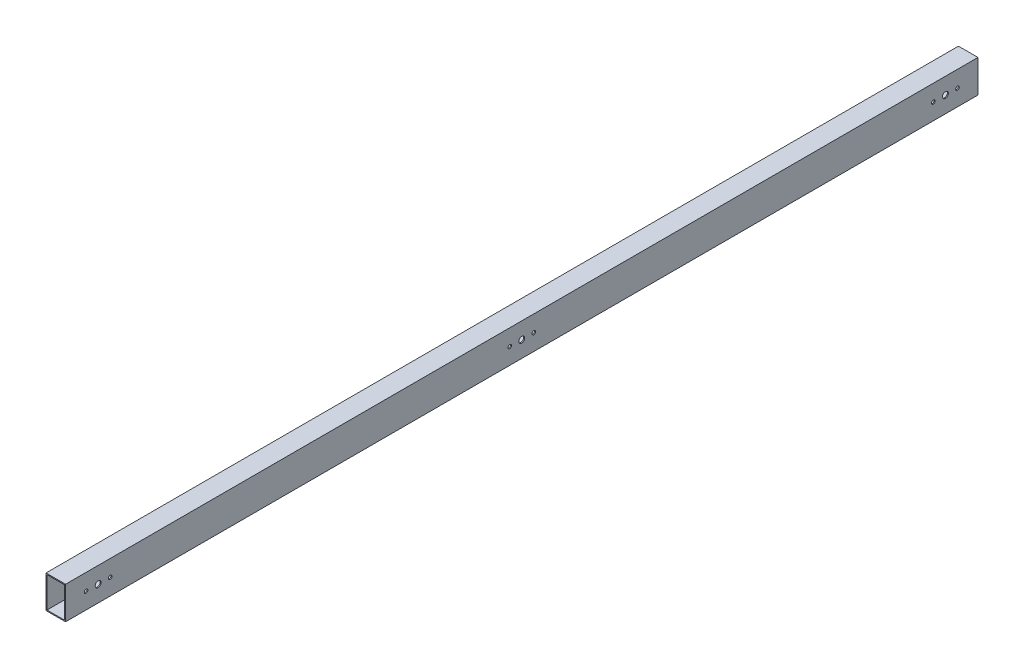
ISO-10303-21;
HEADER;
FILE_DESCRIPTION(('STEP AP214'),'2;1');
FILE_NAME('part.step','',(''),(''),'','','');
FILE_SCHEMA(('AUTOMOTIVE_DESIGN { 1 0 10303 214 1 1 1 1 }'));
ENDSEC;
DATA;
#1=APPLICATION_CONTEXT('core data for automotive mechanical design processes');
#2=APPLICATION_PROTOCOL_DEFINITION('international standard','automotive_design',2000,#1);
#3=PRODUCT_CONTEXT('',#1,'mechanical');
#4=PRODUCT('Part','Part','',(#3));
#5=PRODUCT_RELATED_PRODUCT_CATEGORY('part','',(#4));
#6=PRODUCT_DEFINITION_FORMATION('','',#4);
#7=PRODUCT_DEFINITION_CONTEXT('part definition',#1,'design');
#8=PRODUCT_DEFINITION('design','',#6,#7);
#9=PRODUCT_DEFINITION_SHAPE('','',#8);
#10=(LENGTH_UNIT() NAMED_UNIT(*) SI_UNIT(.MILLI.,.METRE.));
#11=(NAMED_UNIT(*) PLANE_ANGLE_UNIT() SI_UNIT($,.RADIAN.));
#12=(NAMED_UNIT(*) SI_UNIT($,.STERADIAN.) SOLID_ANGLE_UNIT());
#13=UNCERTAINTY_MEASURE_WITH_UNIT(LENGTH_MEASURE(1.E-05),#10,'distance_accuracy_value','');
#14=(GEOMETRIC_REPRESENTATION_CONTEXT(3) GLOBAL_UNCERTAINTY_ASSIGNED_CONTEXT((#13)) GLOBAL_UNIT_ASSIGNED_CONTEXT((#10,
#11,#12)) REPRESENTATION_CONTEXT('',''));
#15=CARTESIAN_POINT('',(0.,0.,0.));
#16=DIRECTION('',(0.,0.,1.));
#17=DIRECTION('',(1.,0.,0.));
#18=AXIS2_PLACEMENT_3D('',#15,#16,#17);
#19=CARTESIAN_POINT('',(30.,0.,1400.));
#20=DIRECTION('',(-1.,0.,0.));
#21=DIRECTION('',(0.,0.,1.));
#22=AXIS2_PLACEMENT_3D('',#19,#20,#21);
#23=PLANE('',#22);
#24=DIRECTION('',(0.,1.,0.));
#25=VECTOR('',#24,1.);
#26=CARTESIAN_POINT('',(30.,0.,0.));
#27=LINE('',#26,#25);
#28=CARTESIAN_POINT('',(30.,0.,0.));
#29=VERTEX_POINT('',#28);
#30=CARTESIAN_POINT('',(30.,50.,0.));
#31=VERTEX_POINT('',#30);
#32=EDGE_CURVE('E154',#29,#31,#27,.T.);
#33=ORIENTED_EDGE('',*,*,#32,.T.);
#34=DIRECTION('',(0.,0.,-1.));
#35=VECTOR('',#34,1.);
#36=CARTESIAN_POINT('',(30.,50.,1400.));
#37=LINE('',#36,#35);
#38=CARTESIAN_POINT('',(30.,50.,1400.));
#39=VERTEX_POINT('',#38);
#40=EDGE_CURVE('E159',#39,#31,#37,.T.);
#41=ORIENTED_EDGE('',*,*,#40,.F.);
#42=DIRECTION('',(0.,1.,0.));
#43=VECTOR('',#42,1.);
#44=CARTESIAN_POINT('',(30.,0.,1400.));
#45=LINE('',#44,#43);
#46=CARTESIAN_POINT('',(30.,0.,1400.));
#47=VERTEX_POINT('',#46);
#48=EDGE_CURVE('E145',#47,#39,#45,.T.);
#49=ORIENTED_EDGE('',*,*,#48,.F.);
#50=DIRECTION('',(0.,0.,-1.));
#51=VECTOR('',#50,1.);
#52=CARTESIAN_POINT('',(30.,0.,1400.));
#53=LINE('',#52,#51);
#54=EDGE_CURVE('E42',#47,#29,#53,.T.);
#55=ORIENTED_EDGE('',*,*,#54,.T.);
#56=EDGE_LOOP('',(#33,#41,#49,#55));
#57=FACE_BOUND('',#56,.T.);
#58=CARTESIAN_POINT('',(30.,25.,681.5));
#59=DIRECTION('',(1.,0.,0.));
#60=DIRECTION('',(0.,0.,-1.));
#61=AXIS2_PLACEMENT_3D('',#58,#59,#60);
#62=CIRCLE('',#61,2.74999999999999);
#63=CARTESIAN_POINT('',(30.,25.,678.75));
#64=VERTEX_POINT('',#63);
#65=EDGE_CURVE('E245',#64,#64,#62,.T.);
#66=ORIENTED_EDGE('',*,*,#65,.F.);
#67=EDGE_LOOP('',(#66));
#68=FACE_BOUND('',#67,.T.);
#69=CARTESIAN_POINT('',(30.,25.,718.5));
#70=DIRECTION('',(1.,0.,0.));
#71=DIRECTION('',(0.,0.,-1.));
#72=AXIS2_PLACEMENT_3D('',#69,#70,#71);
#73=CIRCLE('',#72,2.74999999999999);
#74=CARTESIAN_POINT('',(30.,25.,715.75));
#75=VERTEX_POINT('',#74);
#76=EDGE_CURVE('E238',#75,#75,#73,.T.);
#77=ORIENTED_EDGE('',*,*,#76,.F.);
#78=EDGE_LOOP('',(#77));
#79=FACE_BOUND('',#78,.T.);
#80=CARTESIAN_POINT('',(30.,25.,31.5000000000001));
#81=DIRECTION('',(1.,0.,0.));
#82=DIRECTION('',(0.,0.,-1.));
#83=AXIS2_PLACEMENT_3D('',#80,#81,#82);
#84=CIRCLE('',#83,2.74999999999999);
#85=CARTESIAN_POINT('',(30.,25.,28.7500000000001));
#86=VERTEX_POINT('',#85);
#87=EDGE_CURVE('E231',#86,#86,#84,.T.);
#88=ORIENTED_EDGE('',*,*,#87,.F.);
#89=EDGE_LOOP('',(#88));
#90=FACE_BOUND('',#89,.T.);
#91=CARTESIAN_POINT('',(30.,25.,68.5));
#92=DIRECTION('',(1.,0.,0.));
#93=DIRECTION('',(0.,0.,-1.));
#94=AXIS2_PLACEMENT_3D('',#91,#92,#93);
#95=CIRCLE('',#94,2.74999999999999);
#96=CARTESIAN_POINT('',(30.,25.,65.75));
#97=VERTEX_POINT('',#96);
#98=EDGE_CURVE('E224',#97,#97,#95,.T.);
#99=ORIENTED_EDGE('',*,*,#98,.F.);
#100=EDGE_LOOP('',(#99));
#101=FACE_BOUND('',#100,.T.);
#102=CARTESIAN_POINT('',(30.,25.,1331.5));
#103=DIRECTION('',(1.,0.,0.));
#104=DIRECTION('',(0.,0.,-1.));
#105=AXIS2_PLACEMENT_3D('',#102,#103,#104);
#106=CIRCLE('',#105,2.74999999999999);
#107=CARTESIAN_POINT('',(30.,25.,1328.75));
#108=VERTEX_POINT('',#107);
#109=EDGE_CURVE('E217',#108,#108,#106,.T.);
#110=ORIENTED_EDGE('',*,*,#109,.F.);
#111=EDGE_LOOP('',(#110));
#112=FACE_BOUND('',#111,.T.);
#113=CARTESIAN_POINT('',(30.,25.,1368.5));
#114=DIRECTION('',(1.,0.,0.));
#115=DIRECTION('',(0.,0.,-1.));
#116=AXIS2_PLACEMENT_3D('',#113,#114,#115);
#117=CIRCLE('',#116,2.74999999999999);
#118=CARTESIAN_POINT('',(30.,25.,1365.75));
#119=VERTEX_POINT('',#118);
#120=EDGE_CURVE('E194',#119,#119,#117,.T.);
#121=ORIENTED_EDGE('',*,*,#120,.F.);
#122=EDGE_LOOP('',(#121));
#123=FACE_BOUND('',#122,.T.);
#124=CARTESIAN_POINT('',(30.,25.,50.));
#125=DIRECTION('',(1.,0.,0.));
#126=DIRECTION('',(0.,0.,-1.));
#127=AXIS2_PLACEMENT_3D('',#124,#125,#126);
#128=CIRCLE('',#127,4.49999999999999);
#129=CARTESIAN_POINT('',(30.,25.,45.5000000000001));
#130=VERTEX_POINT('',#129);
#131=EDGE_CURVE('E197',#130,#130,#128,.T.);
#132=ORIENTED_EDGE('',*,*,#131,.F.);
#133=EDGE_LOOP('',(#132));
#134=FACE_BOUND('',#133,.T.);
#135=CARTESIAN_POINT('',(30.,25.,1350.));
#136=DIRECTION('',(1.,0.,0.));
#137=DIRECTION('',(0.,0.,-1.));
#138=AXIS2_PLACEMENT_3D('',#135,#136,#137);
#139=CIRCLE('',#138,4.49999999999999);
#140=CARTESIAN_POINT('',(30.,25.,1345.5));
#141=VERTEX_POINT('',#140);
#142=EDGE_CURVE('E363',#141,#141,#139,.T.);
#143=ORIENTED_EDGE('',*,*,#142,.F.);
#144=EDGE_LOOP('',(#143));
#145=FACE_BOUND('',#144,.T.);
#146=CARTESIAN_POINT('',(30.,25.,700.));
#147=DIRECTION('',(1.,0.,0.));
#148=DIRECTION('',(0.,0.,-1.));
#149=AXIS2_PLACEMENT_3D('',#146,#147,#148);
#150=CIRCLE('',#149,4.49999999999999);
#151=CARTESIAN_POINT('',(30.,25.,695.5));
#152=VERTEX_POINT('',#151);
#153=EDGE_CURVE('E359',#152,#152,#150,.T.);
#154=ORIENTED_EDGE('',*,*,#153,.F.);
#155=EDGE_LOOP('',(#154));
#156=FACE_BOUND('',#155,.T.);
#157=ADVANCED_FACE('F33',(#57,#68,#79,#90,#101,#112,#123,#134,#145,#156),#23,.F.);
#158=CARTESIAN_POINT('',(0.,0.,1400.));
#159=DIRECTION('',(0.,0.,-1.));
#160=DIRECTION('',(-1.,0.,0.));
#161=AXIS2_PLACEMENT_3D('',#158,#159,#160);
#162=PLANE('',#161);
#163=DIRECTION('',(0.,-1.,0.));
#164=VECTOR('',#163,1.);
#165=CARTESIAN_POINT('',(0.,0.,1400.));
#166=LINE('',#165,#164);
#167=CARTESIAN_POINT('',(0.,50.,1400.));
#168=VERTEX_POINT('',#167);
#169=CARTESIAN_POINT('',(0.,0.,1400.));
#170=VERTEX_POINT('',#169);
#171=EDGE_CURVE('E139',#168,#170,#166,.T.);
#172=ORIENTED_EDGE('',*,*,#171,.T.);
#173=DIRECTION('',(1.,0.,0.));
#174=VECTOR('',#173,1.);
#175=CARTESIAN_POINT('',(0.,0.,1400.));
#176=LINE('',#175,#174);
#177=EDGE_CURVE('E142',#170,#47,#176,.T.);
#178=ORIENTED_EDGE('',*,*,#177,.T.);
#179=ORIENTED_EDGE('',*,*,#48,.T.);
#180=DIRECTION('',(-1.,0.,0.));
#181=VECTOR('',#180,1.);
#182=CARTESIAN_POINT('',(0.,50.,1400.));
#183=LINE('',#182,#181);
#184=EDGE_CURVE('E147',#39,#168,#183,.T.);
#185=ORIENTED_EDGE('',*,*,#184,.T.);
#186=EDGE_LOOP('',(#172,#178,#179,#185));
#187=FACE_BOUND('',#186,.T.);
#188=DIRECTION('',(0.,-1.,0.));
#189=VECTOR('',#188,1.);
#190=CARTESIAN_POINT('',(1.5,1.5,1400.));
#191=LINE('',#190,#189);
#192=CARTESIAN_POINT('',(1.5,48.5,1400.));
#193=VERTEX_POINT('',#192);
#194=CARTESIAN_POINT('',(1.5,1.5,1400.));
#195=VERTEX_POINT('',#194);
#196=EDGE_CURVE('E100',#193,#195,#191,.T.);
#197=ORIENTED_EDGE('',*,*,#196,.F.);
#198=DIRECTION('',(-1.,0.,0.));
#199=VECTOR('',#198,1.);
#200=CARTESIAN_POINT('',(1.5,48.5,1400.));
#201=LINE('',#200,#199);
#202=CARTESIAN_POINT('',(28.5,48.5,1400.));
#203=VERTEX_POINT('',#202);
#204=EDGE_CURVE('E123',#203,#193,#201,.T.);
#205=ORIENTED_EDGE('',*,*,#204,.F.);
#206=DIRECTION('',(0.,1.,0.));
#207=VECTOR('',#206,1.);
#208=CARTESIAN_POINT('',(28.5,1.5,1400.));
#209=LINE('',#208,#207);
#210=CARTESIAN_POINT('',(28.5,1.5,1400.));
#211=VERTEX_POINT('',#210);
#212=EDGE_CURVE('E121',#211,#203,#209,.T.);
#213=ORIENTED_EDGE('',*,*,#212,.F.);
#214=DIRECTION('',(1.,0.,0.));
#215=VECTOR('',#214,1.);
#216=CARTESIAN_POINT('',(1.5,1.5,1400.));
#217=LINE('',#216,#215);
#218=EDGE_CURVE('E108',#195,#211,#217,.T.);
#219=ORIENTED_EDGE('',*,*,#218,.F.);
#220=EDGE_LOOP('',(#197,#205,#213,#219));
#221=FACE_BOUND('',#220,.T.);
#222=ADVANCED_FACE('F120',(#187,#221),#162,.F.);
#223=CARTESIAN_POINT('',(0.,0.,0.));
#224=DIRECTION('',(0.,0.,-1.));
#225=DIRECTION('',(-1.,0.,0.));
#226=AXIS2_PLACEMENT_3D('',#223,#224,#225);
#227=PLANE('',#226);
#228=DIRECTION('',(0.,-1.,0.));
#229=VECTOR('',#228,1.);
#230=CARTESIAN_POINT('',(0.,0.,0.));
#231=LINE('',#230,#229);
#232=CARTESIAN_POINT('',(0.,50.,0.));
#233=VERTEX_POINT('',#232);
#234=CARTESIAN_POINT('',(0.,0.,0.));
#235=VERTEX_POINT('',#234);
#236=EDGE_CURVE('E116',#233,#235,#231,.T.);
#237=ORIENTED_EDGE('',*,*,#236,.F.);
#238=DIRECTION('',(-1.,0.,0.));
#239=VECTOR('',#238,1.);
#240=CARTESIAN_POINT('',(0.,50.,0.));
#241=LINE('',#240,#239);
#242=EDGE_CURVE('E143',#31,#233,#241,.T.);
#243=ORIENTED_EDGE('',*,*,#242,.F.);
#244=ORIENTED_EDGE('',*,*,#32,.F.);
#245=DIRECTION('',(1.,0.,0.));
#246=VECTOR('',#245,1.);
#247=CARTESIAN_POINT('',(0.,0.,0.));
#248=LINE('',#247,#246);
#249=EDGE_CURVE('E152',#235,#29,#248,.T.);
#250=ORIENTED_EDGE('',*,*,#249,.F.);
#251=EDGE_LOOP('',(#237,#243,#244,#250));
#252=FACE_BOUND('',#251,.T.);
#253=DIRECTION('',(-1.,0.,0.));
#254=VECTOR('',#253,1.);
#255=CARTESIAN_POINT('',(1.5,48.5,0.));
#256=LINE('',#255,#254);
#257=CARTESIAN_POINT('',(28.5,48.5,0.));
#258=VERTEX_POINT('',#257);
#259=CARTESIAN_POINT('',(1.5,48.5,0.));
#260=VERTEX_POINT('',#259);
#261=EDGE_CURVE('E109',#258,#260,#256,.T.);
#262=ORIENTED_EDGE('',*,*,#261,.T.);
#263=DIRECTION('',(0.,-1.,0.));
#264=VECTOR('',#263,1.);
#265=CARTESIAN_POINT('',(1.5,1.5,0.));
#266=LINE('',#265,#264);
#267=CARTESIAN_POINT('',(1.5,1.5,0.));
#268=VERTEX_POINT('',#267);
#269=EDGE_CURVE('E58',#260,#268,#266,.T.);
#270=ORIENTED_EDGE('',*,*,#269,.T.);
#271=DIRECTION('',(1.,0.,0.));
#272=VECTOR('',#271,1.);
#273=CARTESIAN_POINT('',(1.5,1.5,0.));
#274=LINE('',#273,#272);
#275=CARTESIAN_POINT('',(28.5,1.5,0.));
#276=VERTEX_POINT('',#275);
#277=EDGE_CURVE('E115',#268,#276,#274,.T.);
#278=ORIENTED_EDGE('',*,*,#277,.T.);
#279=DIRECTION('',(0.,1.,0.));
#280=VECTOR('',#279,1.);
#281=CARTESIAN_POINT('',(28.5,1.5,0.));
#282=LINE('',#281,#280);
#283=EDGE_CURVE('E131',#276,#258,#282,.T.);
#284=ORIENTED_EDGE('',*,*,#283,.T.);
#285=EDGE_LOOP('',(#262,#270,#278,#284));
#286=FACE_BOUND('',#285,.T.);
#287=ADVANCED_FACE('F277',(#252,#286),#227,.T.);
#288=CARTESIAN_POINT('',(0.,0.,1400.));
#289=DIRECTION('',(1.,0.,0.));
#290=DIRECTION('',(0.,0.,-1.));
#291=AXIS2_PLACEMENT_3D('',#288,#289,#290);
#292=PLANE('',#291);
#293=CARTESIAN_POINT('',(0.,25.,1350.));
#294=DIRECTION('',(1.,0.,0.));
#295=DIRECTION('',(0.,0.,-1.));
#296=AXIS2_PLACEMENT_3D('',#293,#294,#295);
#297=CIRCLE('',#296,4.5);
#298=CARTESIAN_POINT('',(0.,25.,1345.5));
#299=VERTEX_POINT('',#298);
#300=EDGE_CURVE('E366',#299,#299,#297,.T.);
#301=ORIENTED_EDGE('',*,*,#300,.T.);
#302=EDGE_LOOP('',(#301));
#303=FACE_BOUND('',#302,.T.);
#304=CARTESIAN_POINT('',(0.,25.,50.));
#305=DIRECTION('',(1.,0.,0.));
#306=DIRECTION('',(0.,0.,-1.));
#307=AXIS2_PLACEMENT_3D('',#304,#305,#306);
#308=CIRCLE('',#307,4.5);
#309=CARTESIAN_POINT('',(0.,25.,45.5));
#310=VERTEX_POINT('',#309);
#311=EDGE_CURVE('E190',#310,#310,#308,.T.);
#312=ORIENTED_EDGE('',*,*,#311,.T.);
#313=EDGE_LOOP('',(#312));
#314=FACE_BOUND('',#313,.T.);
#315=CARTESIAN_POINT('',(0.,25.,1368.5));
#316=DIRECTION('',(1.,0.,0.));
#317=DIRECTION('',(0.,0.,-1.));
#318=AXIS2_PLACEMENT_3D('',#315,#316,#317);
#319=CIRCLE('',#318,2.75);
#320=CARTESIAN_POINT('',(0.,25.,1365.75));
#321=VERTEX_POINT('',#320);
#322=EDGE_CURVE('E208',#321,#321,#319,.T.);
#323=ORIENTED_EDGE('',*,*,#322,.T.);
#324=EDGE_LOOP('',(#323));
#325=FACE_BOUND('',#324,.T.);
#326=CARTESIAN_POINT('',(0.,25.,1331.5));
#327=DIRECTION('',(1.,0.,0.));
#328=DIRECTION('',(0.,0.,-1.));
#329=AXIS2_PLACEMENT_3D('',#326,#327,#328);
#330=CIRCLE('',#329,2.75);
#331=CARTESIAN_POINT('',(0.,25.,1328.75));
#332=VERTEX_POINT('',#331);
#333=EDGE_CURVE('E186',#332,#332,#330,.T.);
#334=ORIENTED_EDGE('',*,*,#333,.T.);
#335=EDGE_LOOP('',(#334));
#336=FACE_BOUND('',#335,.T.);
#337=CARTESIAN_POINT('',(0.,25.,68.5));
#338=DIRECTION('',(1.,0.,0.));
#339=DIRECTION('',(0.,0.,-1.));
#340=AXIS2_PLACEMENT_3D('',#337,#338,#339);
#341=CIRCLE('',#340,2.75);
#342=CARTESIAN_POINT('',(0.,25.,65.75));
#343=VERTEX_POINT('',#342);
#344=EDGE_CURVE('E182',#343,#343,#341,.T.);
#345=ORIENTED_EDGE('',*,*,#344,.T.);
#346=EDGE_LOOP('',(#345));
#347=FACE_BOUND('',#346,.T.);
#348=CARTESIAN_POINT('',(0.,25.,31.5000000000001));
#349=DIRECTION('',(1.,0.,0.));
#350=DIRECTION('',(0.,0.,-1.));
#351=AXIS2_PLACEMENT_3D('',#348,#349,#350);
#352=CIRCLE('',#351,2.75);
#353=CARTESIAN_POINT('',(0.,25.,28.7500000000001));
#354=VERTEX_POINT('',#353);
#355=EDGE_CURVE('E177',#354,#354,#352,.T.);
#356=ORIENTED_EDGE('',*,*,#355,.T.);
#357=EDGE_LOOP('',(#356));
#358=FACE_BOUND('',#357,.T.);
#359=CARTESIAN_POINT('',(0.,25.,718.5));
#360=DIRECTION('',(1.,0.,0.));
#361=DIRECTION('',(0.,0.,-1.));
#362=AXIS2_PLACEMENT_3D('',#359,#360,#361);
#363=CIRCLE('',#362,2.75);
#364=CARTESIAN_POINT('',(0.,25.,715.75));
#365=VERTEX_POINT('',#364);
#366=EDGE_CURVE('E172',#365,#365,#363,.T.);
#367=ORIENTED_EDGE('',*,*,#366,.T.);
#368=EDGE_LOOP('',(#367));
#369=FACE_BOUND('',#368,.T.);
#370=CARTESIAN_POINT('',(0.,25.,681.5));
#371=DIRECTION('',(1.,0.,0.));
#372=DIRECTION('',(0.,0.,-1.));
#373=AXIS2_PLACEMENT_3D('',#370,#371,#372);
#374=CIRCLE('',#373,2.75);
#375=CARTESIAN_POINT('',(0.,25.,678.75));
#376=VERTEX_POINT('',#375);
#377=EDGE_CURVE('E167',#376,#376,#374,.T.);
#378=ORIENTED_EDGE('',*,*,#377,.T.);
#379=EDGE_LOOP('',(#378));
#380=FACE_BOUND('',#379,.T.);
#381=ORIENTED_EDGE('',*,*,#236,.T.);
#382=DIRECTION('',(0.,0.,-1.));
#383=VECTOR('',#382,1.);
#384=CARTESIAN_POINT('',(0.,0.,1400.));
#385=LINE('',#384,#383);
#386=EDGE_CURVE('E11',#170,#235,#385,.T.);
#387=ORIENTED_EDGE('',*,*,#386,.F.);
#388=ORIENTED_EDGE('',*,*,#171,.F.);
#389=DIRECTION('',(0.,0.,-1.));
#390=VECTOR('',#389,1.);
#391=CARTESIAN_POINT('',(0.,50.,1400.));
#392=LINE('',#391,#390);
#393=EDGE_CURVE('E149',#168,#233,#392,.T.);
#394=ORIENTED_EDGE('',*,*,#393,.T.);
#395=EDGE_LOOP('',(#381,#387,#388,#394));
#396=FACE_BOUND('',#395,.T.);
#397=ADVANCED_FACE('F35',(#303,#314,#325,#336,#347,#358,#369,#380,#396),#292,.F.);
#398=CARTESIAN_POINT('',(0.,0.,1400.));
#399=DIRECTION('',(0.,1.,0.));
#400=DIRECTION('',(0.,0.,1.));
#401=AXIS2_PLACEMENT_3D('',#398,#399,#400);
#402=PLANE('',#401);
#403=ORIENTED_EDGE('',*,*,#249,.T.);
#404=ORIENTED_EDGE('',*,*,#54,.F.);
#405=ORIENTED_EDGE('',*,*,#177,.F.);
#406=ORIENTED_EDGE('',*,*,#386,.T.);
#407=EDGE_LOOP('',(#403,#404,#405,#406));
#408=FACE_BOUND('',#407,.T.);
#409=ADVANCED_FACE('F265',(#408),#402,.F.);
#410=CARTESIAN_POINT('',(0.,50.,1400.));
#411=DIRECTION('',(0.,-1.,0.));
#412=DIRECTION('',(0.,0.,-1.));
#413=AXIS2_PLACEMENT_3D('',#410,#411,#412);
#414=PLANE('',#413);
#415=ORIENTED_EDGE('',*,*,#242,.T.);
#416=ORIENTED_EDGE('',*,*,#393,.F.);
#417=ORIENTED_EDGE('',*,*,#184,.F.);
#418=ORIENTED_EDGE('',*,*,#40,.T.);
#419=EDGE_LOOP('',(#415,#416,#417,#418));
#420=FACE_BOUND('',#419,.T.);
#421=ADVANCED_FACE('F256',(#420),#414,.F.);
#422=CARTESIAN_POINT('',(1.5,1.5,1400.));
#423=DIRECTION('',(1.,0.,0.));
#424=DIRECTION('',(0.,0.,-1.));
#425=AXIS2_PLACEMENT_3D('',#422,#423,#424);
#426=PLANE('',#425);
#427=CARTESIAN_POINT('',(1.5,25.,1350.));
#428=DIRECTION('',(1.,0.,0.));
#429=DIRECTION('',(0.,0.,-1.));
#430=AXIS2_PLACEMENT_3D('',#427,#428,#429);
#431=CIRCLE('',#430,4.49999999999999);
#432=CARTESIAN_POINT('',(1.5,25.,1345.5));
#433=VERTEX_POINT('',#432);
#434=EDGE_CURVE('E37',#433,#433,#431,.T.);
#435=ORIENTED_EDGE('',*,*,#434,.F.);
#436=EDGE_LOOP('',(#435));
#437=FACE_BOUND('',#436,.T.);
#438=CARTESIAN_POINT('',(1.5,25.,50.));
#439=DIRECTION('',(1.,0.,0.));
#440=DIRECTION('',(0.,0.,-1.));
#441=AXIS2_PLACEMENT_3D('',#438,#439,#440);
#442=CIRCLE('',#441,4.49999999999999);
#443=CARTESIAN_POINT('',(1.5,25.,45.5000000000001));
#444=VERTEX_POINT('',#443);
#445=EDGE_CURVE('E189',#444,#444,#442,.T.);
#446=ORIENTED_EDGE('',*,*,#445,.F.);
#447=EDGE_LOOP('',(#446));
#448=FACE_BOUND('',#447,.T.);
#449=CARTESIAN_POINT('',(1.5,25.,1368.5));
#450=DIRECTION('',(1.,0.,0.));
#451=DIRECTION('',(0.,0.,-1.));
#452=AXIS2_PLACEMENT_3D('',#449,#450,#451);
#453=CIRCLE('',#452,2.74999999999999);
#454=CARTESIAN_POINT('',(1.5,25.,1365.75));
#455=VERTEX_POINT('',#454);
#456=EDGE_CURVE('E214',#455,#455,#453,.T.);
#457=ORIENTED_EDGE('',*,*,#456,.F.);
#458=EDGE_LOOP('',(#457));
#459=FACE_BOUND('',#458,.T.);
#460=CARTESIAN_POINT('',(1.5,25.,1331.5));
#461=DIRECTION('',(1.,0.,0.));
#462=DIRECTION('',(0.,0.,-1.));
#463=AXIS2_PLACEMENT_3D('',#460,#461,#462);
#464=CIRCLE('',#463,2.74999999999999);
#465=CARTESIAN_POINT('',(1.5,25.,1328.75));
#466=VERTEX_POINT('',#465);
#467=EDGE_CURVE('E185',#466,#466,#464,.T.);
#468=ORIENTED_EDGE('',*,*,#467,.F.);
#469=EDGE_LOOP('',(#468));
#470=FACE_BOUND('',#469,.T.);
#471=CARTESIAN_POINT('',(1.5,25.,68.5));
#472=DIRECTION('',(1.,0.,0.));
#473=DIRECTION('',(0.,0.,-1.));
#474=AXIS2_PLACEMENT_3D('',#471,#472,#473);
#475=CIRCLE('',#474,2.74999999999999);
#476=CARTESIAN_POINT('',(1.5,25.,65.75));
#477=VERTEX_POINT('',#476);
#478=EDGE_CURVE('E181',#477,#477,#475,.T.);
#479=ORIENTED_EDGE('',*,*,#478,.F.);
#480=EDGE_LOOP('',(#479));
#481=FACE_BOUND('',#480,.T.);
#482=CARTESIAN_POINT('',(1.5,25.,31.5000000000001));
#483=DIRECTION('',(1.,0.,0.));
#484=DIRECTION('',(0.,0.,-1.));
#485=AXIS2_PLACEMENT_3D('',#482,#483,#484);
#486=CIRCLE('',#485,2.74999999999999);
#487=CARTESIAN_POINT('',(1.5,25.,28.7500000000001));
#488=VERTEX_POINT('',#487);
#489=EDGE_CURVE('E176',#488,#488,#486,.T.);
#490=ORIENTED_EDGE('',*,*,#489,.F.);
#491=EDGE_LOOP('',(#490));
#492=FACE_BOUND('',#491,.T.);
#493=CARTESIAN_POINT('',(1.5,25.,718.5));
#494=DIRECTION('',(1.,0.,0.));
#495=DIRECTION('',(0.,0.,-1.));
#496=AXIS2_PLACEMENT_3D('',#493,#494,#495);
#497=CIRCLE('',#496,2.74999999999999);
#498=CARTESIAN_POINT('',(1.5,25.,715.75));
#499=VERTEX_POINT('',#498);
#500=EDGE_CURVE('E171',#499,#499,#497,.T.);
#501=ORIENTED_EDGE('',*,*,#500,.F.);
#502=EDGE_LOOP('',(#501));
#503=FACE_BOUND('',#502,.T.);
#504=CARTESIAN_POINT('',(1.5,25.,681.5));
#505=DIRECTION('',(1.,0.,0.));
#506=DIRECTION('',(0.,0.,-1.));
#507=AXIS2_PLACEMENT_3D('',#504,#505,#506);
#508=CIRCLE('',#507,2.74999999999999);
#509=CARTESIAN_POINT('',(1.5,25.,678.75));
#510=VERTEX_POINT('',#509);
#511=EDGE_CURVE('E129',#510,#510,#508,.T.);
#512=ORIENTED_EDGE('',*,*,#511,.F.);
#513=EDGE_LOOP('',(#512));
#514=FACE_BOUND('',#513,.T.);
#515=ORIENTED_EDGE('',*,*,#269,.F.);
#516=DIRECTION('',(0.,0.,-1.));
#517=VECTOR('',#516,1.);
#518=CARTESIAN_POINT('',(1.5,48.5,1400.));
#519=LINE('',#518,#517);
#520=EDGE_CURVE('E104',#193,#260,#519,.T.);
#521=ORIENTED_EDGE('',*,*,#520,.F.);
#522=ORIENTED_EDGE('',*,*,#196,.T.);
#523=DIRECTION('',(0.,0.,-1.));
#524=VECTOR('',#523,1.);
#525=CARTESIAN_POINT('',(1.5,1.5,1400.));
#526=LINE('',#525,#524);
#527=EDGE_CURVE('E103',#195,#268,#526,.T.);
#528=ORIENTED_EDGE('',*,*,#527,.T.);
#529=EDGE_LOOP('',(#515,#521,#522,#528));
#530=FACE_BOUND('',#529,.T.);
#531=ADVANCED_FACE('F102',(#437,#448,#459,#470,#481,#492,#503,#514,#530),#426,.T.);
#532=CARTESIAN_POINT('',(1.5,1.5,1400.));
#533=DIRECTION('',(0.,1.,0.));
#534=DIRECTION('',(-1.,0.,0.));
#535=AXIS2_PLACEMENT_3D('',#532,#533,#534);
#536=PLANE('',#535);
#537=ORIENTED_EDGE('',*,*,#277,.F.);
#538=ORIENTED_EDGE('',*,*,#527,.F.);
#539=ORIENTED_EDGE('',*,*,#218,.T.);
#540=DIRECTION('',(0.,0.,-1.));
#541=VECTOR('',#540,1.);
#542=CARTESIAN_POINT('',(28.5,1.5,1400.));
#543=LINE('',#542,#541);
#544=EDGE_CURVE('E117',#211,#276,#543,.T.);
#545=ORIENTED_EDGE('',*,*,#544,.T.);
#546=EDGE_LOOP('',(#537,#538,#539,#545));
#547=FACE_BOUND('',#546,.T.);
#548=ADVANCED_FACE('F112',(#547),#536,.T.);
#549=CARTESIAN_POINT('',(28.5,1.5,1400.));
#550=DIRECTION('',(-1.,0.,0.));
#551=DIRECTION('',(0.,0.,1.));
#552=AXIS2_PLACEMENT_3D('',#549,#550,#551);
#553=PLANE('',#552);
#554=CARTESIAN_POINT('',(28.5,25.,700.));
#555=DIRECTION('',(-1.,0.,0.));
#556=DIRECTION('',(0.,0.,1.));
#557=AXIS2_PLACEMENT_3D('',#554,#555,#556);
#558=CIRCLE('',#557,4.5);
#559=CARTESIAN_POINT('',(28.5,25.,704.5));
#560=VERTEX_POINT('',#559);
#561=EDGE_CURVE('E362',#560,#560,#558,.T.);
#562=ORIENTED_EDGE('',*,*,#561,.F.);
#563=EDGE_LOOP('',(#562));
#564=FACE_BOUND('',#563,.T.);
#565=CARTESIAN_POINT('',(28.5,25.,1350.));
#566=DIRECTION('',(-1.,0.,0.));
#567=DIRECTION('',(0.,0.,1.));
#568=AXIS2_PLACEMENT_3D('',#565,#566,#567);
#569=CIRCLE('',#568,4.49999999999999);
#570=CARTESIAN_POINT('',(28.5,25.,1354.5));
#571=VERTEX_POINT('',#570);
#572=EDGE_CURVE('E202',#571,#571,#569,.T.);
#573=ORIENTED_EDGE('',*,*,#572,.F.);
#574=EDGE_LOOP('',(#573));
#575=FACE_BOUND('',#574,.T.);
#576=CARTESIAN_POINT('',(28.5,25.,50.));
#577=DIRECTION('',(-1.,0.,0.));
#578=DIRECTION('',(0.,0.,1.));
#579=AXIS2_PLACEMENT_3D('',#576,#577,#578);
#580=CIRCLE('',#579,4.49999999999999);
#581=CARTESIAN_POINT('',(28.5,25.,54.5));
#582=VERTEX_POINT('',#581);
#583=EDGE_CURVE('E187',#582,#582,#580,.T.);
#584=ORIENTED_EDGE('',*,*,#583,.F.);
#585=EDGE_LOOP('',(#584));
#586=FACE_BOUND('',#585,.T.);
#587=CARTESIAN_POINT('',(28.5,25.,1368.5));
#588=DIRECTION('',(-1.,0.,0.));
#589=DIRECTION('',(0.,0.,1.));
#590=AXIS2_PLACEMENT_3D('',#587,#588,#589);
#591=CIRCLE('',#590,2.74999999999999);
#592=CARTESIAN_POINT('',(28.5,25.,1371.25));
#593=VERTEX_POINT('',#592);
#594=EDGE_CURVE('E211',#593,#593,#591,.T.);
#595=ORIENTED_EDGE('',*,*,#594,.F.);
#596=EDGE_LOOP('',(#595));
#597=FACE_BOUND('',#596,.T.);
#598=CARTESIAN_POINT('',(28.5,25.,1331.5));
#599=DIRECTION('',(-1.,0.,0.));
#600=DIRECTION('',(0.,0.,1.));
#601=AXIS2_PLACEMENT_3D('',#598,#599,#600);
#602=CIRCLE('',#601,2.74999999999999);
#603=CARTESIAN_POINT('',(28.5,25.,1334.25));
#604=VERTEX_POINT('',#603);
#605=EDGE_CURVE('E183',#604,#604,#602,.T.);
#606=ORIENTED_EDGE('',*,*,#605,.F.);
#607=EDGE_LOOP('',(#606));
#608=FACE_BOUND('',#607,.T.);
#609=CARTESIAN_POINT('',(28.5,25.,68.5));
#610=DIRECTION('',(-1.,0.,0.));
#611=DIRECTION('',(0.,0.,1.));
#612=AXIS2_PLACEMENT_3D('',#609,#610,#611);
#613=CIRCLE('',#612,2.74999999999999);
#614=CARTESIAN_POINT('',(28.5,25.,71.25));
#615=VERTEX_POINT('',#614);
#616=EDGE_CURVE('E178',#615,#615,#613,.T.);
#617=ORIENTED_EDGE('',*,*,#616,.F.);
#618=EDGE_LOOP('',(#617));
#619=FACE_BOUND('',#618,.T.);
#620=CARTESIAN_POINT('',(28.5,25.,31.5000000000001));
#621=DIRECTION('',(-1.,0.,0.));
#622=DIRECTION('',(0.,0.,1.));
#623=AXIS2_PLACEMENT_3D('',#620,#621,#622);
#624=CIRCLE('',#623,2.74999999999999);
#625=CARTESIAN_POINT('',(28.5,25.,34.2500000000001));
#626=VERTEX_POINT('',#625);
#627=EDGE_CURVE('E173',#626,#626,#624,.T.);
#628=ORIENTED_EDGE('',*,*,#627,.F.);
#629=EDGE_LOOP('',(#628));
#630=FACE_BOUND('',#629,.T.);
#631=CARTESIAN_POINT('',(28.5,25.,718.5));
#632=DIRECTION('',(-1.,0.,0.));
#633=DIRECTION('',(0.,0.,1.));
#634=AXIS2_PLACEMENT_3D('',#631,#632,#633);
#635=CIRCLE('',#634,2.74999999999999);
#636=CARTESIAN_POINT('',(28.5,25.,721.25));
#637=VERTEX_POINT('',#636);
#638=EDGE_CURVE('E168',#637,#637,#635,.T.);
#639=ORIENTED_EDGE('',*,*,#638,.F.);
#640=EDGE_LOOP('',(#639));
#641=FACE_BOUND('',#640,.T.);
#642=CARTESIAN_POINT('',(28.5,25.,681.5));
#643=DIRECTION('',(-1.,0.,0.));
#644=DIRECTION('',(0.,0.,1.));
#645=AXIS2_PLACEMENT_3D('',#642,#643,#644);
#646=CIRCLE('',#645,2.74999999999999);
#647=CARTESIAN_POINT('',(28.5,25.,684.25));
#648=VERTEX_POINT('',#647);
#649=EDGE_CURVE('E164',#648,#648,#646,.T.);
#650=ORIENTED_EDGE('',*,*,#649,.F.);
#651=EDGE_LOOP('',(#650));
#652=FACE_BOUND('',#651,.T.);
#653=ORIENTED_EDGE('',*,*,#283,.F.);
#654=ORIENTED_EDGE('',*,*,#544,.F.);
#655=ORIENTED_EDGE('',*,*,#212,.T.);
#656=DIRECTION('',(0.,0.,-1.));
#657=VECTOR('',#656,1.);
#658=CARTESIAN_POINT('',(28.5,48.5,1400.));
#659=LINE('',#658,#657);
#660=EDGE_CURVE('E50',#203,#258,#659,.T.);
#661=ORIENTED_EDGE('',*,*,#660,.T.);
#662=EDGE_LOOP('',(#653,#654,#655,#661));
#663=FACE_BOUND('',#662,.T.);
#664=ADVANCED_FACE('F263',(#564,#575,#586,#597,#608,#619,#630,#641,#652,#663),#553,.T.);
#665=CARTESIAN_POINT('',(1.5,48.5,1400.));
#666=DIRECTION('',(0.,-1.,0.));
#667=DIRECTION('',(0.,0.,-1.));
#668=AXIS2_PLACEMENT_3D('',#665,#666,#667);
#669=PLANE('',#668);
#670=ORIENTED_EDGE('',*,*,#261,.F.);
#671=ORIENTED_EDGE('',*,*,#660,.F.);
#672=ORIENTED_EDGE('',*,*,#204,.T.);
#673=ORIENTED_EDGE('',*,*,#520,.T.);
#674=EDGE_LOOP('',(#670,#671,#672,#673));
#675=FACE_BOUND('',#674,.T.);
#676=ADVANCED_FACE('F302',(#675),#669,.T.);
#677=CARTESIAN_POINT('',(30.,25.,681.5));
#678=DIRECTION('',(1.,0.,0.));
#679=DIRECTION('',(0.,0.,-1.));
#680=AXIS2_PLACEMENT_3D('',#677,#678,#679);
#681=CYLINDRICAL_SURFACE('',#680,2.74999999999999);
#682=ORIENTED_EDGE('',*,*,#649,.T.);
#683=EDGE_LOOP('',(#682));
#684=FACE_BOUND('',#683,.T.);
#685=ORIENTED_EDGE('',*,*,#65,.T.);
#686=EDGE_LOOP('',(#685));
#687=FACE_BOUND('',#686,.T.);
#688=ADVANCED_FACE('F304',(#684,#687),#681,.F.);
#689=ORIENTED_EDGE('',*,*,#511,.T.);
#690=EDGE_LOOP('',(#689));
#691=FACE_BOUND('',#690,.T.);
#692=ORIENTED_EDGE('',*,*,#377,.F.);
#693=EDGE_LOOP('',(#692));
#694=FACE_BOUND('',#693,.T.);
#695=ADVANCED_FACE('F252',(#691,#694),#681,.F.);
#696=CARTESIAN_POINT('',(30.,25.,718.5));
#697=DIRECTION('',(1.,0.,0.));
#698=DIRECTION('',(0.,0.,-1.));
#699=AXIS2_PLACEMENT_3D('',#696,#697,#698);
#700=CYLINDRICAL_SURFACE('',#699,2.74999999999999);
#701=ORIENTED_EDGE('',*,*,#638,.T.);
#702=EDGE_LOOP('',(#701));
#703=FACE_BOUND('',#702,.T.);
#704=ORIENTED_EDGE('',*,*,#76,.T.);
#705=EDGE_LOOP('',(#704));
#706=FACE_BOUND('',#705,.T.);
#707=ADVANCED_FACE('F315',(#703,#706),#700,.F.);
#708=ORIENTED_EDGE('',*,*,#500,.T.);
#709=EDGE_LOOP('',(#708));
#710=FACE_BOUND('',#709,.T.);
#711=ORIENTED_EDGE('',*,*,#366,.F.);
#712=EDGE_LOOP('',(#711));
#713=FACE_BOUND('',#712,.T.);
#714=ADVANCED_FACE('F318',(#710,#713),#700,.F.);
#715=CARTESIAN_POINT('',(30.,25.,31.5000000000001));
#716=DIRECTION('',(1.,0.,0.));
#717=DIRECTION('',(0.,0.,-1.));
#718=AXIS2_PLACEMENT_3D('',#715,#716,#717);
#719=CYLINDRICAL_SURFACE('',#718,2.74999999999999);
#720=ORIENTED_EDGE('',*,*,#627,.T.);
#721=EDGE_LOOP('',(#720));
#722=FACE_BOUND('',#721,.T.);
#723=ORIENTED_EDGE('',*,*,#87,.T.);
#724=EDGE_LOOP('',(#723));
#725=FACE_BOUND('',#724,.T.);
#726=ADVANCED_FACE('F320',(#722,#725),#719,.F.);
#727=ORIENTED_EDGE('',*,*,#489,.T.);
#728=EDGE_LOOP('',(#727));
#729=FACE_BOUND('',#728,.T.);
#730=ORIENTED_EDGE('',*,*,#355,.F.);
#731=EDGE_LOOP('',(#730));
#732=FACE_BOUND('',#731,.T.);
#733=ADVANCED_FACE('F323',(#729,#732),#719,.F.);
#734=CARTESIAN_POINT('',(30.,25.,68.5));
#735=DIRECTION('',(1.,0.,0.));
#736=DIRECTION('',(0.,0.,-1.));
#737=AXIS2_PLACEMENT_3D('',#734,#735,#736);
#738=CYLINDRICAL_SURFACE('',#737,2.74999999999999);
#739=ORIENTED_EDGE('',*,*,#616,.T.);
#740=EDGE_LOOP('',(#739));
#741=FACE_BOUND('',#740,.T.);
#742=ORIENTED_EDGE('',*,*,#98,.T.);
#743=EDGE_LOOP('',(#742));
#744=FACE_BOUND('',#743,.T.);
#745=ADVANCED_FACE('F325',(#741,#744),#738,.F.);
#746=ORIENTED_EDGE('',*,*,#478,.T.);
#747=EDGE_LOOP('',(#746));
#748=FACE_BOUND('',#747,.T.);
#749=ORIENTED_EDGE('',*,*,#344,.F.);
#750=EDGE_LOOP('',(#749));
#751=FACE_BOUND('',#750,.T.);
#752=ADVANCED_FACE('F328',(#748,#751),#738,.F.);
#753=CARTESIAN_POINT('',(30.,25.,1331.5));
#754=DIRECTION('',(1.,0.,0.));
#755=DIRECTION('',(0.,0.,-1.));
#756=AXIS2_PLACEMENT_3D('',#753,#754,#755);
#757=CYLINDRICAL_SURFACE('',#756,2.74999999999999);
#758=ORIENTED_EDGE('',*,*,#605,.T.);
#759=EDGE_LOOP('',(#758));
#760=FACE_BOUND('',#759,.T.);
#761=ORIENTED_EDGE('',*,*,#109,.T.);
#762=EDGE_LOOP('',(#761));
#763=FACE_BOUND('',#762,.T.);
#764=ADVANCED_FACE('F330',(#760,#763),#757,.F.);
#765=ORIENTED_EDGE('',*,*,#467,.T.);
#766=EDGE_LOOP('',(#765));
#767=FACE_BOUND('',#766,.T.);
#768=ORIENTED_EDGE('',*,*,#333,.F.);
#769=EDGE_LOOP('',(#768));
#770=FACE_BOUND('',#769,.T.);
#771=ADVANCED_FACE('F333',(#767,#770),#757,.F.);
#772=CARTESIAN_POINT('',(30.,25.,1368.5));
#773=DIRECTION('',(1.,0.,0.));
#774=DIRECTION('',(0.,0.,-1.));
#775=AXIS2_PLACEMENT_3D('',#772,#773,#774);
#776=CYLINDRICAL_SURFACE('',#775,2.74999999999999);
#777=ORIENTED_EDGE('',*,*,#456,.T.);
#778=EDGE_LOOP('',(#777));
#779=FACE_BOUND('',#778,.T.);
#780=ORIENTED_EDGE('',*,*,#322,.F.);
#781=EDGE_LOOP('',(#780));
#782=FACE_BOUND('',#781,.T.);
#783=ADVANCED_FACE('F339',(#779,#782),#776,.F.);
#784=ORIENTED_EDGE('',*,*,#594,.T.);
#785=EDGE_LOOP('',(#784));
#786=FACE_BOUND('',#785,.T.);
#787=ORIENTED_EDGE('',*,*,#120,.T.);
#788=EDGE_LOOP('',(#787));
#789=FACE_BOUND('',#788,.T.);
#790=ADVANCED_FACE('F335',(#786,#789),#776,.F.);
#791=CARTESIAN_POINT('',(30.,25.,50.));
#792=DIRECTION('',(1.,0.,0.));
#793=DIRECTION('',(0.,0.,-1.));
#794=AXIS2_PLACEMENT_3D('',#791,#792,#793);
#795=CYLINDRICAL_SURFACE('',#794,4.49999999999999);
#796=ORIENTED_EDGE('',*,*,#583,.T.);
#797=EDGE_LOOP('',(#796));
#798=FACE_BOUND('',#797,.T.);
#799=ORIENTED_EDGE('',*,*,#131,.T.);
#800=EDGE_LOOP('',(#799));
#801=FACE_BOUND('',#800,.T.);
#802=ADVANCED_FACE('F338',(#798,#801),#795,.F.);
#803=ORIENTED_EDGE('',*,*,#445,.T.);
#804=EDGE_LOOP('',(#803));
#805=FACE_BOUND('',#804,.T.);
#806=ORIENTED_EDGE('',*,*,#311,.F.);
#807=EDGE_LOOP('',(#806));
#808=FACE_BOUND('',#807,.T.);
#809=ADVANCED_FACE('F343',(#805,#808),#795,.F.);
#810=CARTESIAN_POINT('',(30.,25.,1350.));
#811=DIRECTION('',(1.,0.,0.));
#812=DIRECTION('',(0.,0.,-1.));
#813=AXIS2_PLACEMENT_3D('',#810,#811,#812);
#814=CYLINDRICAL_SURFACE('',#813,4.49999999999999);
#815=ORIENTED_EDGE('',*,*,#434,.T.);
#816=EDGE_LOOP('',(#815));
#817=FACE_BOUND('',#816,.T.);
#818=ORIENTED_EDGE('',*,*,#300,.F.);
#819=EDGE_LOOP('',(#818));
#820=FACE_BOUND('',#819,.T.);
#821=ADVANCED_FACE('F344',(#817,#820),#814,.F.);
#822=ORIENTED_EDGE('',*,*,#572,.T.);
#823=EDGE_LOOP('',(#822));
#824=FACE_BOUND('',#823,.T.);
#825=ORIENTED_EDGE('',*,*,#142,.T.);
#826=EDGE_LOOP('',(#825));
#827=FACE_BOUND('',#826,.T.);
#828=ADVANCED_FACE('F347',(#824,#827),#814,.F.);
#829=CARTESIAN_POINT('',(30.,25.,700.));
#830=DIRECTION('',(1.,0.,0.));
#831=DIRECTION('',(0.,0.,-1.));
#832=AXIS2_PLACEMENT_3D('',#829,#830,#831);
#833=CYLINDRICAL_SURFACE('',#832,4.5);
#834=ORIENTED_EDGE('',*,*,#153,.T.);
#835=EDGE_LOOP('',(#834));
#836=FACE_BOUND('',#835,.T.);
#837=ORIENTED_EDGE('',*,*,#561,.T.);
#838=EDGE_LOOP('',(#837));
#839=FACE_BOUND('',#838,.T.);
#840=ADVANCED_FACE('F349',(#836,#839),#833,.F.);
#841=CLOSED_SHELL('',(#157,#222,#287,#397,#409,#421,#531,#548,#664,#676,#688,#695,#707,#714,
#726,#733,#745,#752,#764,#771,#783,#790,#802,#809,#821,#828,#840));
#842=MANIFOLD_SOLID_BREP('B2',#841);
#843=ADVANCED_BREP_SHAPE_REPRESENTATION('',(#18,#842),#14);
#844=SHAPE_DEFINITION_REPRESENTATION(#9,#843);
ENDSEC;
END-ISO-10303-21;
